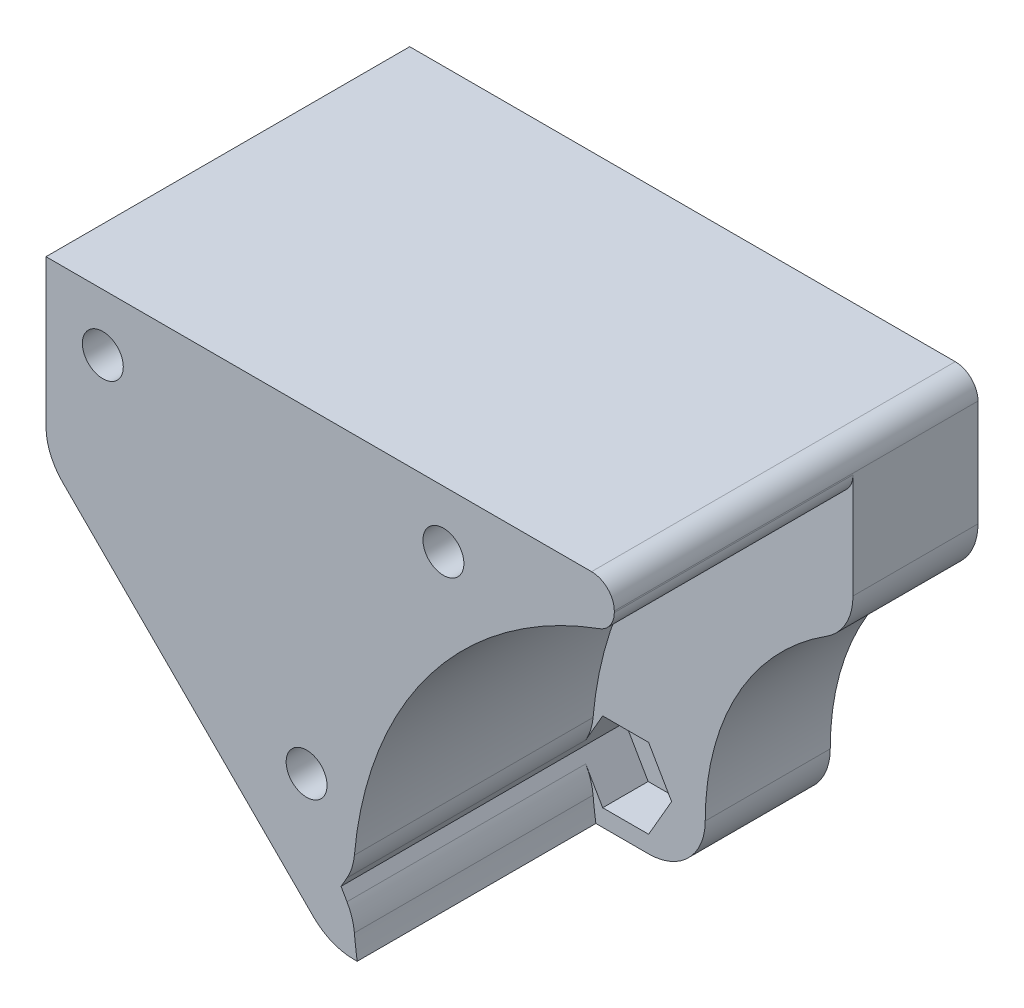
ISO-10303-21;
HEADER;
FILE_DESCRIPTION(('STEP AP214'),'2;1');
FILE_NAME('part.step','',(''),(''),'','','');
FILE_SCHEMA(('AUTOMOTIVE_DESIGN { 1 0 10303 214 1 1 1 1 }'));
ENDSEC;
DATA;
#1=APPLICATION_CONTEXT('core data for automotive mechanical design processes');
#2=APPLICATION_PROTOCOL_DEFINITION('international standard','automotive_design',2000,#1);
#3=PRODUCT_CONTEXT('',#1,'mechanical');
#4=PRODUCT('Part','Part','',(#3));
#5=PRODUCT_RELATED_PRODUCT_CATEGORY('part','',(#4));
#6=PRODUCT_DEFINITION_FORMATION('','',#4);
#7=PRODUCT_DEFINITION_CONTEXT('part definition',#1,'design');
#8=PRODUCT_DEFINITION('design','',#6,#7);
#9=PRODUCT_DEFINITION_SHAPE('','',#8);
#10=(LENGTH_UNIT() NAMED_UNIT(*) SI_UNIT(.MILLI.,.METRE.));
#11=(NAMED_UNIT(*) PLANE_ANGLE_UNIT() SI_UNIT($,.RADIAN.));
#12=(NAMED_UNIT(*) SI_UNIT($,.STERADIAN.) SOLID_ANGLE_UNIT());
#13=UNCERTAINTY_MEASURE_WITH_UNIT(LENGTH_MEASURE(1.E-05),#10,'distance_accuracy_value','');
#14=(GEOMETRIC_REPRESENTATION_CONTEXT(3) GLOBAL_UNCERTAINTY_ASSIGNED_CONTEXT((#13)) GLOBAL_UNIT_ASSIGNED_CONTEXT((#10,
#11,#12)) REPRESENTATION_CONTEXT('',''));
#15=CARTESIAN_POINT('',(0.,0.,0.));
#16=DIRECTION('',(0.,0.,1.));
#17=DIRECTION('',(1.,0.,0.));
#18=AXIS2_PLACEMENT_3D('',#15,#16,#17);
#19=CARTESIAN_POINT('',(12.7,6.35000000000008,13.97));
#20=DIRECTION('',(0.,0.,1.));
#21=DIRECTION('',(1.,0.,0.));
#22=AXIS2_PLACEMENT_3D('',#19,#20,#21);
#23=CYLINDRICAL_SURFACE('',#22,41.91);
#24=CARTESIAN_POINT('',(12.7,6.35000000000008,13.97));
#25=DIRECTION('',(0.,0.,1.));
#26=DIRECTION('',(1.,0.,0.));
#27=AXIS2_PLACEMENT_3D('',#24,#25,#26);
#28=CIRCLE('',#27,41.91);
#29=CARTESIAN_POINT('',(-29.0410163699359,2.59025899765198,13.97));
#30=VERTEX_POINT('',#29);
#31=CARTESIAN_POINT('',(-28.7261463329622,0.,13.97));
#32=VERTEX_POINT('',#31);
#33=EDGE_CURVE('E274',#30,#32,#28,.T.);
#34=ORIENTED_EDGE('',*,*,#33,.F.);
#35=DIRECTION('',(0.,0.,1.));
#36=VECTOR('',#35,1.);
#37=CARTESIAN_POINT('',(-29.0410163699359,2.59025899765198,13.97));
#38=LINE('',#37,#36);
#39=CARTESIAN_POINT('',(-29.0410163699359,2.59025899765198,40.64));
#40=VERTEX_POINT('',#39);
#41=EDGE_CURVE('E422',#30,#40,#38,.T.);
#42=ORIENTED_EDGE('',*,*,#41,.T.);
#43=CARTESIAN_POINT('',(12.7,6.35000000000008,40.64));
#44=DIRECTION('',(0.,0.,1.));
#45=DIRECTION('',(1.,0.,0.));
#46=AXIS2_PLACEMENT_3D('',#43,#44,#45);
#47=CIRCLE('',#46,41.91);
#48=CARTESIAN_POINT('',(-28.7261463329622,0.,40.64));
#49=VERTEX_POINT('',#48);
#50=EDGE_CURVE('E268',#40,#49,#47,.T.);
#51=ORIENTED_EDGE('',*,*,#50,.T.);
#52=DIRECTION('',(0.,0.,1.));
#53=VECTOR('',#52,1.);
#54=CARTESIAN_POINT('',(-28.7261463329622,0.,13.97));
#55=LINE('',#54,#53);
#56=EDGE_CURVE('E333',#32,#49,#55,.T.);
#57=ORIENTED_EDGE('',*,*,#56,.F.);
#58=EDGE_LOOP('',(#34,#42,#51,#57));
#59=FACE_BOUND('',#58,.T.);
#60=ADVANCED_FACE('F45',(#59),#23,.F.);
#61=CARTESIAN_POINT('',(-25.3999999999999,6.34999999999929,40.64));
#62=DIRECTION('',(0.,0.,-1.));
#63=DIRECTION('',(-1.,0.,0.));
#64=AXIS2_PLACEMENT_3D('',#61,#62,#63);
#65=CYLINDRICAL_SURFACE('',#64,2.28600000000001);
#66=CARTESIAN_POINT('',(-25.3999999999999,6.34999999999929,0.));
#67=DIRECTION('',(0.,0.,-1.));
#68=DIRECTION('',(-1.,0.,0.));
#69=AXIS2_PLACEMENT_3D('',#66,#67,#68);
#70=CIRCLE('',#69,2.28600000000001);
#71=CARTESIAN_POINT('',(-27.6859999999999,6.34999999999929,0.));
#72=VERTEX_POINT('',#71);
#73=EDGE_CURVE('E261',#72,#72,#70,.T.);
#74=ORIENTED_EDGE('',*,*,#73,.T.);
#75=EDGE_LOOP('',(#74));
#76=FACE_BOUND('',#75,.T.);
#77=CARTESIAN_POINT('',(-25.3999999999999,6.34999999999929,8.89));
#78=DIRECTION('',(0.,0.,1.));
#79=DIRECTION('',(1.,0.,0.));
#80=AXIS2_PLACEMENT_3D('',#77,#78,#79);
#81=CIRCLE('',#80,2.28600000000001);
#82=CARTESIAN_POINT('',(-23.1139999999999,6.34999999999929,8.89));
#83=VERTEX_POINT('',#82);
#84=EDGE_CURVE('E259',#83,#83,#81,.F.);
#85=ORIENTED_EDGE('',*,*,#84,.F.);
#86=EDGE_LOOP('',(#85));
#87=FACE_BOUND('',#86,.T.);
#88=ADVANCED_FACE('F533',(#76,#87),#65,.F.);
#89=CARTESIAN_POINT('',(0.,0.,40.64));
#90=DIRECTION('',(0.,0.,1.));
#91=DIRECTION('',(1.,0.,0.));
#92=AXIS2_PLACEMENT_3D('',#89,#90,#91);
#93=PLANE('',#92);
#94=DIRECTION('',(-0.5,-0.866025403784438,0.));
#95=VECTOR('',#94,1.);
#96=CARTESIAN_POINT('',(-27.9663219465478,10.7949999999993,40.64));
#97=LINE('',#96,#95);
#98=CARTESIAN_POINT('',(-29.8661514755922,7.50439872997479,40.64));
#99=VERTEX_POINT('',#98);
#100=CARTESIAN_POINT('',(-30.5326438930957,6.34999999999929,40.64));
#101=VERTEX_POINT('',#100);
#102=EDGE_CURVE('E211',#99,#101,#97,.T.);
#103=ORIENTED_EDGE('',*,*,#102,.F.);
#104=CARTESIAN_POINT('',(-35.3654127896234,10.6793987299748,40.64));
#105=DIRECTION('',(0.,0.,1.));
#106=DIRECTION('',(1.,0.,0.));
#107=AXIS2_PLACEMENT_3D('',#104,#105,#106);
#108=CIRCLE('',#107,6.35);
#109=CARTESIAN_POINT('',(-29.0410163699361,10.1097410023465,40.64));
#110=VERTEX_POINT('',#109);
#111=EDGE_CURVE('E420',#99,#110,#108,.T.);
#112=ORIENTED_EDGE('',*,*,#111,.T.);
#113=CARTESIAN_POINT('',(-1.66914285714286,45.7197324546539,40.64));
#114=VERTEX_POINT('',#113);
#115=EDGE_CURVE('E275',#114,#110,#47,.T.);
#116=ORIENTED_EDGE('',*,*,#115,.F.);
#117=CARTESIAN_POINT('',(-2.54,48.105776845845,40.64));
#118=DIRECTION('',(0.,0.,1.));
#119=DIRECTION('',(1.,0.,0.));
#120=AXIS2_PLACEMENT_3D('',#117,#118,#119);
#121=CIRCLE('',#120,2.54);
#122=CARTESIAN_POINT('',(0.,48.105776845845,40.64));
#123=VERTEX_POINT('',#122);
#124=EDGE_CURVE('E407',#114,#123,#121,.T.);
#125=ORIENTED_EDGE('',*,*,#124,.T.);
#126=DIRECTION('',(0.,1.,0.));
#127=VECTOR('',#126,1.);
#128=CARTESIAN_POINT('',(0.,0.,40.64));
#129=LINE('',#128,#127);
#130=CARTESIAN_POINT('',(0.,48.26,40.64));
#131=VERTEX_POINT('',#130);
#132=EDGE_CURVE('E300',#123,#131,#129,.T.);
#133=ORIENTED_EDGE('',*,*,#132,.T.);
#134=CARTESIAN_POINT('',(-2.54,48.26,40.64));
#135=DIRECTION('',(0.,0.,1.));
#136=DIRECTION('',(1.,0.,0.));
#137=AXIS2_PLACEMENT_3D('',#134,#135,#136);
#138=CIRCLE('',#137,2.54);
#139=CARTESIAN_POINT('',(-2.54,50.8,40.64));
#140=VERTEX_POINT('',#139);
#141=EDGE_CURVE('E409',#131,#140,#138,.T.);
#142=ORIENTED_EDGE('',*,*,#141,.T.);
#143=DIRECTION('',(-1.,0.,0.));
#144=VECTOR('',#143,1.);
#145=CARTESIAN_POINT('',(0.,50.8,40.64));
#146=LINE('',#145,#144);
#147=CARTESIAN_POINT('',(-63.5,50.8,40.64));
#148=VERTEX_POINT('',#147);
#149=EDGE_CURVE('E303',#140,#148,#146,.T.);
#150=ORIENTED_EDGE('',*,*,#149,.T.);
#151=DIRECTION('',(0.,-1.,0.));
#152=VECTOR('',#151,1.);
#153=CARTESIAN_POINT('',(-63.5,31.75,40.64));
#154=LINE('',#153,#152);
#155=CARTESIAN_POINT('',(-63.5,34.3802561210692,40.64));
#156=VERTEX_POINT('',#155);
#157=EDGE_CURVE('E306',#148,#156,#154,.T.);
#158=ORIENTED_EDGE('',*,*,#157,.T.);
#159=CARTESIAN_POINT('',(-57.15,34.3802561210692,40.64));
#160=DIRECTION('',(0.,0.,1.));
#161=DIRECTION('',(1.,0.,0.));
#162=AXIS2_PLACEMENT_3D('',#159,#160,#161);
#163=CIRCLE('',#162,6.35);
#164=CARTESIAN_POINT('',(-61.6401280605346,29.8901280605346,40.64));
#165=VERTEX_POINT('',#164);
#166=EDGE_CURVE('E391',#156,#165,#163,.T.);
#167=ORIENTED_EDGE('',*,*,#166,.T.);
#168=DIRECTION('',(0.707106781186552,-0.707106781186543,0.));
#169=VECTOR('',#168,1.);
#170=CARTESIAN_POINT('',(-63.5,31.75,40.64));
#171=LINE('',#170,#169);
#172=CARTESIAN_POINT('',(-33.6098719394651,1.8598719394654,40.64));
#173=VERTEX_POINT('',#172);
#174=EDGE_CURVE('E309',#165,#173,#171,.T.);
#175=ORIENTED_EDGE('',*,*,#174,.T.);
#176=CARTESIAN_POINT('',(-29.1197438789305,6.35,40.64));
#177=DIRECTION('',(0.,0.,1.));
#178=DIRECTION('',(1.,0.,0.));
#179=AXIS2_PLACEMENT_3D('',#176,#177,#178);
#180=CIRCLE('',#179,6.35);
#181=CARTESIAN_POINT('',(-29.1197438789305,0.,40.64));
#182=VERTEX_POINT('',#181);
#183=EDGE_CURVE('E393',#173,#182,#180,.T.);
#184=ORIENTED_EDGE('',*,*,#183,.T.);
#185=DIRECTION('',(1.,0.,0.));
#186=VECTOR('',#185,1.);
#187=CARTESIAN_POINT('',(0.,0.,40.64));
#188=LINE('',#187,#186);
#189=EDGE_CURVE('E312',#182,#49,#188,.T.);
#190=ORIENTED_EDGE('',*,*,#189,.T.);
#191=ORIENTED_EDGE('',*,*,#50,.F.);
#192=CARTESIAN_POINT('',(-35.3654127896232,2.02060127002348,40.64));
#193=DIRECTION('',(0.,0.,1.));
#194=DIRECTION('',(1.,0.,0.));
#195=AXIS2_PLACEMENT_3D('',#192,#193,#194);
#196=CIRCLE('',#195,6.35);
#197=CARTESIAN_POINT('',(-29.866151475592,5.19560127002348,40.64));
#198=VERTEX_POINT('',#197);
#199=EDGE_CURVE('E236',#40,#198,#196,.T.);
#200=ORIENTED_EDGE('',*,*,#199,.T.);
#201=DIRECTION('',(0.5,-0.866025403784439,0.));
#202=VECTOR('',#201,1.);
#203=CARTESIAN_POINT('',(-30.5326438930957,6.34999999999929,40.64));
#204=LINE('',#203,#202);
#205=EDGE_CURVE('E220',#101,#198,#204,.T.);
#206=ORIENTED_EDGE('',*,*,#205,.F.);
#207=EDGE_LOOP('',(#103,#112,#116,#125,#133,#142,#150,#158,#167,#175,#184,#190,#191,#200,#206));
#208=FACE_BOUND('',#207,.T.);
#209=CARTESIAN_POINT('',(-19.0917717752222,44.45,40.64));
#210=DIRECTION('',(0.,0.,1.));
#211=DIRECTION('',(1.,0.,0.));
#212=AXIS2_PLACEMENT_3D('',#209,#210,#211);
#213=CIRCLE('',#212,2.286);
#214=CARTESIAN_POINT('',(-16.8057717752222,44.45,40.64));
#215=VERTEX_POINT('',#214);
#216=EDGE_CURVE('E288',#215,#215,#213,.T.);
#217=ORIENTED_EDGE('',*,*,#216,.F.);
#218=EDGE_LOOP('',(#217));
#219=FACE_BOUND('',#218,.T.);
#220=CARTESIAN_POINT('',(-57.15,44.45,40.64));
#221=DIRECTION('',(0.,0.,1.));
#222=DIRECTION('',(1.,0.,0.));
#223=AXIS2_PLACEMENT_3D('',#220,#221,#222);
#224=CIRCLE('',#223,2.28599999999999);
#225=CARTESIAN_POINT('',(-54.864,44.45,40.64));
#226=VERTEX_POINT('',#225);
#227=EDGE_CURVE('E294',#226,#226,#224,.T.);
#228=ORIENTED_EDGE('',*,*,#227,.F.);
#229=EDGE_LOOP('',(#228));
#230=FACE_BOUND('',#229,.T.);
#231=CARTESIAN_POINT('',(-34.380256121069,15.3302561210692,40.64));
#232=DIRECTION('',(0.,0.,1.));
#233=DIRECTION('',(1.,0.,0.));
#234=AXIS2_PLACEMENT_3D('',#231,#232,#233);
#235=CIRCLE('',#234,2.28599999999999);
#236=CARTESIAN_POINT('',(-32.094256121069,15.3302561210692,40.64));
#237=VERTEX_POINT('',#236);
#238=EDGE_CURVE('E281',#237,#237,#235,.T.);
#239=ORIENTED_EDGE('',*,*,#238,.F.);
#240=EDGE_LOOP('',(#239));
#241=FACE_BOUND('',#240,.T.);
#242=ADVANCED_FACE('F233',(#208,#219,#230,#241),#93,.T.);
#243=CARTESIAN_POINT('',(0.,0.,0.));
#244=DIRECTION('',(0.,0.,1.));
#245=DIRECTION('',(1.,0.,0.));
#246=AXIS2_PLACEMENT_3D('',#243,#244,#245);
#247=PLANE('',#246);
#248=ORIENTED_EDGE('',*,*,#73,.F.);
#249=EDGE_LOOP('',(#248));
#250=FACE_BOUND('',#249,.T.);
#251=DIRECTION('',(-1.,0.,0.));
#252=VECTOR('',#251,1.);
#253=CARTESIAN_POINT('',(0.,50.8,0.));
#254=LINE('',#253,#252);
#255=CARTESIAN_POINT('',(-2.54,50.8,0.));
#256=VERTEX_POINT('',#255);
#257=CARTESIAN_POINT('',(-63.5,50.8,0.));
#258=VERTEX_POINT('',#257);
#259=EDGE_CURVE('E318',#256,#258,#254,.T.);
#260=ORIENTED_EDGE('',*,*,#259,.F.);
#261=CARTESIAN_POINT('',(-2.54,48.26,0.));
#262=DIRECTION('',(0.,0.,1.));
#263=DIRECTION('',(1.,0.,0.));
#264=AXIS2_PLACEMENT_3D('',#261,#262,#263);
#265=CIRCLE('',#264,2.54);
#266=CARTESIAN_POINT('',(0.,48.26,0.));
#267=VERTEX_POINT('',#266);
#268=EDGE_CURVE('E400',#256,#267,#265,.F.);
#269=ORIENTED_EDGE('',*,*,#268,.T.);
#270=DIRECTION('',(0.,1.,0.));
#271=VECTOR('',#270,1.);
#272=CARTESIAN_POINT('',(0.,0.,0.));
#273=LINE('',#272,#271);
#274=CARTESIAN_POINT('',(0.,36.3768396605438,0.));
#275=VERTEX_POINT('',#274);
#276=EDGE_CURVE('E297',#275,#267,#273,.T.);
#277=ORIENTED_EDGE('',*,*,#276,.F.);
#278=CARTESIAN_POINT('',(-6.35,36.3768396605438,0.));
#279=DIRECTION('',(0.,0.,1.));
#280=DIRECTION('',(1.,0.,0.));
#281=AXIS2_PLACEMENT_3D('',#278,#279,#280);
#282=CIRCLE('',#281,6.35);
#283=CARTESIAN_POINT('',(-2.94821428571428,31.0149040068752,0.));
#284=VERTEX_POINT('',#283);
#285=EDGE_CURVE('E368',#275,#284,#282,.F.);
#286=ORIENTED_EDGE('',*,*,#285,.T.);
#287=CARTESIAN_POINT('',(12.7,6.35000000000008,0.));
#288=DIRECTION('',(0.,0.,-1.));
#289=DIRECTION('',(-1.,0.,0.));
#290=AXIS2_PLACEMENT_3D('',#287,#288,#289);
#291=CIRCLE('',#290,29.21);
#292=CARTESIAN_POINT('',(-16.51,6.35000000000001,0.));
#293=VERTEX_POINT('',#292);
#294=EDGE_CURVE('E264',#293,#284,#291,.T.);
#295=ORIENTED_EDGE('',*,*,#294,.F.);
#296=CARTESIAN_POINT('',(-22.86,6.35,0.));
#297=DIRECTION('',(0.,0.,1.));
#298=DIRECTION('',(1.,0.,0.));
#299=AXIS2_PLACEMENT_3D('',#296,#297,#298);
#300=CIRCLE('',#299,6.35);
#301=CARTESIAN_POINT('',(-22.86,0.,0.));
#302=VERTEX_POINT('',#301);
#303=EDGE_CURVE('E365',#293,#302,#300,.F.);
#304=ORIENTED_EDGE('',*,*,#303,.T.);
#305=DIRECTION('',(1.,0.,0.));
#306=VECTOR('',#305,1.);
#307=CARTESIAN_POINT('',(0.,0.,0.));
#308=LINE('',#307,#306);
#309=CARTESIAN_POINT('',(-29.1197438789305,0.,0.));
#310=VERTEX_POINT('',#309);
#311=EDGE_CURVE('E304',#310,#302,#308,.T.);
#312=ORIENTED_EDGE('',*,*,#311,.F.);
#313=CARTESIAN_POINT('',(-29.1197438789305,6.35,0.));
#314=DIRECTION('',(0.,0.,1.));
#315=DIRECTION('',(1.,0.,0.));
#316=AXIS2_PLACEMENT_3D('',#313,#314,#315);
#317=CIRCLE('',#316,6.35);
#318=CARTESIAN_POINT('',(-33.6098719394651,1.8598719394654,0.));
#319=VERTEX_POINT('',#318);
#320=EDGE_CURVE('E363',#310,#319,#317,.F.);
#321=ORIENTED_EDGE('',*,*,#320,.T.);
#322=DIRECTION('',(0.707106781186552,-0.707106781186543,0.));
#323=VECTOR('',#322,1.);
#324=CARTESIAN_POINT('',(-63.5,31.75,0.));
#325=LINE('',#324,#323);
#326=CARTESIAN_POINT('',(-61.6401280605346,29.8901280605346,0.));
#327=VERTEX_POINT('',#326);
#328=EDGE_CURVE('E323',#327,#319,#325,.T.);
#329=ORIENTED_EDGE('',*,*,#328,.F.);
#330=CARTESIAN_POINT('',(-57.15,34.3802561210692,0.));
#331=DIRECTION('',(0.,0.,1.));
#332=DIRECTION('',(1.,0.,0.));
#333=AXIS2_PLACEMENT_3D('',#330,#331,#332);
#334=CIRCLE('',#333,6.35);
#335=CARTESIAN_POINT('',(-63.5,34.3802561210692,0.));
#336=VERTEX_POINT('',#335);
#337=EDGE_CURVE('E361',#327,#336,#334,.F.);
#338=ORIENTED_EDGE('',*,*,#337,.T.);
#339=DIRECTION('',(0.,-1.,0.));
#340=VECTOR('',#339,1.);
#341=CARTESIAN_POINT('',(-63.5,31.75,0.));
#342=LINE('',#341,#340);
#343=EDGE_CURVE('E320',#258,#336,#342,.T.);
#344=ORIENTED_EDGE('',*,*,#343,.F.);
#345=EDGE_LOOP('',(#260,#269,#277,#286,#295,#304,#312,#321,#329,#338,#344));
#346=FACE_BOUND('',#345,.T.);
#347=CARTESIAN_POINT('',(-57.15,44.45,0.));
#348=DIRECTION('',(0.,0.,1.));
#349=DIRECTION('',(1.,0.,0.));
#350=AXIS2_PLACEMENT_3D('',#347,#348,#349);
#351=CIRCLE('',#350,2.28599999999999);
#352=CARTESIAN_POINT('',(-54.864,44.45,0.));
#353=VERTEX_POINT('',#352);
#354=EDGE_CURVE('E291',#353,#353,#351,.T.);
#355=ORIENTED_EDGE('',*,*,#354,.T.);
#356=EDGE_LOOP('',(#355));
#357=FACE_BOUND('',#356,.T.);
#358=CARTESIAN_POINT('',(-19.0917717752222,44.45,0.));
#359=DIRECTION('',(0.,0.,1.));
#360=DIRECTION('',(1.,0.,0.));
#361=AXIS2_PLACEMENT_3D('',#358,#359,#360);
#362=CIRCLE('',#361,2.286);
#363=CARTESIAN_POINT('',(-16.8057717752222,44.45,0.));
#364=VERTEX_POINT('',#363);
#365=EDGE_CURVE('E285',#364,#364,#362,.T.);
#366=ORIENTED_EDGE('',*,*,#365,.T.);
#367=EDGE_LOOP('',(#366));
#368=FACE_BOUND('',#367,.T.);
#369=CARTESIAN_POINT('',(-34.380256121069,15.3302561210692,0.));
#370=DIRECTION('',(0.,0.,1.));
#371=DIRECTION('',(1.,0.,0.));
#372=AXIS2_PLACEMENT_3D('',#369,#370,#371);
#373=CIRCLE('',#372,2.28599999999999);
#374=CARTESIAN_POINT('',(-32.094256121069,15.3302561210692,0.));
#375=VERTEX_POINT('',#374);
#376=EDGE_CURVE('E280',#375,#375,#373,.T.);
#377=ORIENTED_EDGE('',*,*,#376,.T.);
#378=EDGE_LOOP('',(#377));
#379=FACE_BOUND('',#378,.T.);
#380=ADVANCED_FACE('F474',(#250,#346,#357,#368,#379),#247,.F.);
#381=CARTESIAN_POINT('',(0.,0.,40.64));
#382=DIRECTION('',(-1.,0.,0.));
#383=DIRECTION('',(0.,0.,1.));
#384=AXIS2_PLACEMENT_3D('',#381,#382,#383);
#385=PLANE('',#384);
#386=ORIENTED_EDGE('',*,*,#276,.T.);
#387=DIRECTION('',(0.,0.,-1.));
#388=VECTOR('',#387,1.);
#389=CARTESIAN_POINT('',(0.,48.26,40.64));
#390=LINE('',#389,#388);
#391=EDGE_CURVE('E405',#267,#131,#390,.F.);
#392=ORIENTED_EDGE('',*,*,#391,.T.);
#393=ORIENTED_EDGE('',*,*,#132,.F.);
#394=DIRECTION('',(0.,0.,1.));
#395=VECTOR('',#394,1.);
#396=CARTESIAN_POINT('',(0.,48.105776845845,40.64));
#397=LINE('',#396,#395);
#398=CARTESIAN_POINT('',(0.,48.105776845845,13.97));
#399=VERTEX_POINT('',#398);
#400=EDGE_CURVE('E402',#123,#399,#397,.F.);
#401=ORIENTED_EDGE('',*,*,#400,.T.);
#402=DIRECTION('',(0.,1.,0.));
#403=VECTOR('',#402,1.);
#404=CARTESIAN_POINT('',(0.,0.,13.97));
#405=LINE('',#404,#403);
#406=CARTESIAN_POINT('',(0.,36.3768396605438,13.97));
#407=VERTEX_POINT('',#406);
#408=EDGE_CURVE('E273',#407,#399,#405,.T.);
#409=ORIENTED_EDGE('',*,*,#408,.F.);
#410=DIRECTION('',(0.,0.,-1.));
#411=VECTOR('',#410,1.);
#412=CARTESIAN_POINT('',(0.,36.3768396605438,40.64));
#413=LINE('',#412,#411);
#414=EDGE_CURVE('E358',#407,#275,#413,.T.);
#415=ORIENTED_EDGE('',*,*,#414,.T.);
#416=EDGE_LOOP('',(#386,#392,#393,#401,#409,#415));
#417=FACE_BOUND('',#416,.T.);
#418=ADVANCED_FACE('F447',(#417),#385,.F.);
#419=CARTESIAN_POINT('',(0.,50.8,40.64));
#420=DIRECTION('',(0.,-1.,0.));
#421=DIRECTION('',(1.,0.,0.));
#422=AXIS2_PLACEMENT_3D('',#419,#420,#421);
#423=PLANE('',#422);
#424=ORIENTED_EDGE('',*,*,#149,.F.);
#425=DIRECTION('',(0.,0.,-1.));
#426=VECTOR('',#425,1.);
#427=CARTESIAN_POINT('',(-2.54,50.8,40.64));
#428=LINE('',#427,#426);
#429=EDGE_CURVE('E397',#140,#256,#428,.T.);
#430=ORIENTED_EDGE('',*,*,#429,.T.);
#431=ORIENTED_EDGE('',*,*,#259,.T.);
#432=DIRECTION('',(0.,0.,-1.));
#433=VECTOR('',#432,1.);
#434=CARTESIAN_POINT('',(-63.5,50.8,40.64));
#435=LINE('',#434,#433);
#436=EDGE_CURVE('E315',#148,#258,#435,.T.);
#437=ORIENTED_EDGE('',*,*,#436,.F.);
#438=EDGE_LOOP('',(#424,#430,#431,#437));
#439=FACE_BOUND('',#438,.T.);
#440=ADVANCED_FACE('F457',(#439),#423,.F.);
#441=CARTESIAN_POINT('',(-63.5,31.75,40.64));
#442=DIRECTION('',(1.,0.,0.));
#443=DIRECTION('',(0.,0.,-1.));
#444=AXIS2_PLACEMENT_3D('',#441,#442,#443);
#445=PLANE('',#444);
#446=ORIENTED_EDGE('',*,*,#343,.T.);
#447=DIRECTION('',(0.,0.,-1.));
#448=VECTOR('',#447,1.);
#449=CARTESIAN_POINT('',(-63.5,34.3802561210692,40.64));
#450=LINE('',#449,#448);
#451=EDGE_CURVE('E395',#336,#156,#450,.F.);
#452=ORIENTED_EDGE('',*,*,#451,.T.);
#453=ORIENTED_EDGE('',*,*,#157,.F.);
#454=ORIENTED_EDGE('',*,*,#436,.T.);
#455=EDGE_LOOP('',(#446,#452,#453,#454));
#456=FACE_BOUND('',#455,.T.);
#457=ADVANCED_FACE('F462',(#456),#445,.F.);
#458=CARTESIAN_POINT('',(-63.5,31.75,40.64));
#459=DIRECTION('',(0.707106781186543,0.707106781186552,0.));
#460=DIRECTION('',(-0.707106781186552,0.707106781186543,0.));
#461=AXIS2_PLACEMENT_3D('',#458,#459,#460);
#462=PLANE('',#461);
#463=ORIENTED_EDGE('',*,*,#328,.T.);
#464=DIRECTION('',(0.,0.,-1.));
#465=VECTOR('',#464,1.);
#466=CARTESIAN_POINT('',(-33.6098719394651,1.8598719394654,40.64));
#467=LINE('',#466,#465);
#468=EDGE_CURVE('E389',#319,#173,#467,.F.);
#469=ORIENTED_EDGE('',*,*,#468,.T.);
#470=ORIENTED_EDGE('',*,*,#174,.F.);
#471=DIRECTION('',(0.,0.,-1.));
#472=VECTOR('',#471,1.);
#473=CARTESIAN_POINT('',(-61.6401280605346,29.8901280605346,40.64));
#474=LINE('',#473,#472);
#475=EDGE_CURVE('E386',#165,#327,#474,.T.);
#476=ORIENTED_EDGE('',*,*,#475,.T.);
#477=EDGE_LOOP('',(#463,#469,#470,#476));
#478=FACE_BOUND('',#477,.T.);
#479=ADVANCED_FACE('F471',(#478),#462,.F.);
#480=CARTESIAN_POINT('',(0.,0.,40.64));
#481=DIRECTION('',(0.,1.,0.));
#482=DIRECTION('',(0.,0.,1.));
#483=AXIS2_PLACEMENT_3D('',#480,#481,#482);
#484=PLANE('',#483);
#485=ORIENTED_EDGE('',*,*,#311,.T.);
#486=DIRECTION('',(0.,0.,-1.));
#487=VECTOR('',#486,1.);
#488=CARTESIAN_POINT('',(-22.86,0.,40.64));
#489=LINE('',#488,#487);
#490=CARTESIAN_POINT('',(-22.86,0.,13.97));
#491=VERTEX_POINT('',#490);
#492=EDGE_CURVE('E383',#302,#491,#489,.F.);
#493=ORIENTED_EDGE('',*,*,#492,.T.);
#494=DIRECTION('',(1.,0.,0.));
#495=VECTOR('',#494,1.);
#496=CARTESIAN_POINT('',(0.,0.,13.97));
#497=LINE('',#496,#495);
#498=EDGE_CURVE('E330',#32,#491,#497,.T.);
#499=ORIENTED_EDGE('',*,*,#498,.F.);
#500=ORIENTED_EDGE('',*,*,#56,.T.);
#501=ORIENTED_EDGE('',*,*,#189,.F.);
#502=DIRECTION('',(0.,0.,-1.));
#503=VECTOR('',#502,1.);
#504=CARTESIAN_POINT('',(-29.1197438789305,0.,40.64));
#505=LINE('',#504,#503);
#506=EDGE_CURVE('E380',#182,#310,#505,.T.);
#507=ORIENTED_EDGE('',*,*,#506,.T.);
#508=EDGE_LOOP('',(#485,#493,#499,#500,#501,#507));
#509=FACE_BOUND('',#508,.T.);
#510=ADVANCED_FACE('F483',(#509),#484,.F.);
#511=CARTESIAN_POINT('',(-57.15,44.45,40.64));
#512=DIRECTION('',(0.,0.,-1.));
#513=DIRECTION('',(-1.,0.,0.));
#514=AXIS2_PLACEMENT_3D('',#511,#512,#513);
#515=CYLINDRICAL_SURFACE('',#514,2.28599999999999);
#516=ORIENTED_EDGE('',*,*,#227,.T.);
#517=EDGE_LOOP('',(#516));
#518=FACE_BOUND('',#517,.T.);
#519=ORIENTED_EDGE('',*,*,#354,.F.);
#520=EDGE_LOOP('',(#519));
#521=FACE_BOUND('',#520,.T.);
#522=ADVANCED_FACE('F554',(#518,#521),#515,.F.);
#523=CARTESIAN_POINT('',(-19.0917717752222,44.45,40.64));
#524=DIRECTION('',(0.,0.,-1.));
#525=DIRECTION('',(-1.,0.,0.));
#526=AXIS2_PLACEMENT_3D('',#523,#524,#525);
#527=CYLINDRICAL_SURFACE('',#526,2.286);
#528=ORIENTED_EDGE('',*,*,#216,.T.);
#529=EDGE_LOOP('',(#528));
#530=FACE_BOUND('',#529,.T.);
#531=ORIENTED_EDGE('',*,*,#365,.F.);
#532=EDGE_LOOP('',(#531));
#533=FACE_BOUND('',#532,.T.);
#534=ADVANCED_FACE('F549',(#530,#533),#527,.F.);
#535=CARTESIAN_POINT('',(-34.380256121069,15.3302561210692,40.64));
#536=DIRECTION('',(0.,0.,-1.));
#537=DIRECTION('',(-1.,0.,0.));
#538=AXIS2_PLACEMENT_3D('',#535,#536,#537);
#539=CYLINDRICAL_SURFACE('',#538,2.28599999999999);
#540=ORIENTED_EDGE('',*,*,#238,.T.);
#541=EDGE_LOOP('',(#540));
#542=FACE_BOUND('',#541,.T.);
#543=ORIENTED_EDGE('',*,*,#376,.F.);
#544=EDGE_LOOP('',(#543));
#545=FACE_BOUND('',#544,.T.);
#546=ADVANCED_FACE('F543',(#542,#545),#539,.F.);
#547=ORIENTED_EDGE('',*,*,#115,.T.);
#548=DIRECTION('',(0.,0.,1.));
#549=VECTOR('',#548,1.);
#550=CARTESIAN_POINT('',(-29.0410163699361,10.1097410023465,13.97));
#551=LINE('',#550,#549);
#552=CARTESIAN_POINT('',(-29.0410163699361,10.1097410023465,13.97));
#553=VERTEX_POINT('',#552);
#554=EDGE_CURVE('E415',#110,#553,#551,.F.);
#555=ORIENTED_EDGE('',*,*,#554,.T.);
#556=CARTESIAN_POINT('',(-1.66914285714286,45.7197324546539,13.97));
#557=VERTEX_POINT('',#556);
#558=EDGE_CURVE('E269',#557,#553,#28,.T.);
#559=ORIENTED_EDGE('',*,*,#558,.F.);
#560=DIRECTION('',(0.,0.,1.));
#561=VECTOR('',#560,1.);
#562=CARTESIAN_POINT('',(-1.66914285714286,45.7197324546539,13.97));
#563=LINE('',#562,#561);
#564=EDGE_CURVE('E411',#557,#114,#563,.T.);
#565=ORIENTED_EDGE('',*,*,#564,.T.);
#566=EDGE_LOOP('',(#547,#555,#559,#565));
#567=FACE_BOUND('',#566,.T.);
#568=ADVANCED_FACE('F438',(#567),#23,.F.);
#569=CARTESIAN_POINT('',(12.7,6.35000000000008,13.97));
#570=DIRECTION('',(0.,0.,1.));
#571=DIRECTION('',(1.,0.,0.));
#572=AXIS2_PLACEMENT_3D('',#569,#570,#571);
#573=PLANE('',#572);
#574=CARTESIAN_POINT('',(12.7,6.35000000000008,13.97));
#575=DIRECTION('',(0.,0.,1.));
#576=DIRECTION('',(1.,0.,0.));
#577=AXIS2_PLACEMENT_3D('',#574,#575,#576);
#578=CIRCLE('',#577,29.21);
#579=CARTESIAN_POINT('',(-2.94821428571428,31.0149040068752,13.97));
#580=VERTEX_POINT('',#579);
#581=CARTESIAN_POINT('',(-16.51,6.35000000000001,13.97));
#582=VERTEX_POINT('',#581);
#583=EDGE_CURVE('E336',#580,#582,#578,.T.);
#584=ORIENTED_EDGE('',*,*,#583,.F.);
#585=CARTESIAN_POINT('',(-6.35,36.3768396605438,13.97));
#586=DIRECTION('',(0.,0.,1.));
#587=DIRECTION('',(1.,0.,0.));
#588=AXIS2_PLACEMENT_3D('',#585,#586,#587);
#589=CIRCLE('',#588,6.35);
#590=EDGE_CURVE('E378',#580,#407,#589,.T.);
#591=ORIENTED_EDGE('',*,*,#590,.T.);
#592=ORIENTED_EDGE('',*,*,#408,.T.);
#593=CARTESIAN_POINT('',(-2.54,48.105776845845,13.97));
#594=DIRECTION('',(0.,0.,1.));
#595=DIRECTION('',(1.,0.,0.));
#596=AXIS2_PLACEMENT_3D('',#593,#594,#595);
#597=CIRCLE('',#596,2.54);
#598=EDGE_CURVE('E413',#399,#557,#597,.F.);
#599=ORIENTED_EDGE('',*,*,#598,.T.);
#600=ORIENTED_EDGE('',*,*,#558,.T.);
#601=CARTESIAN_POINT('',(-35.3654127896234,10.6793987299748,13.97));
#602=DIRECTION('',(0.,0.,1.));
#603=DIRECTION('',(1.,0.,0.));
#604=AXIS2_PLACEMENT_3D('',#601,#602,#603);
#605=CIRCLE('',#604,6.35);
#606=CARTESIAN_POINT('',(-29.8661514755922,7.50439872997479,13.97));
#607=VERTEX_POINT('',#606);
#608=EDGE_CURVE('E53',#553,#607,#605,.F.);
#609=ORIENTED_EDGE('',*,*,#608,.T.);
#610=DIRECTION('',(-0.5,-0.866025403784439,0.));
#611=VECTOR('',#610,1.);
#612=CARTESIAN_POINT('',(-19.7244829198214,25.0702839420934,13.97));
#613=LINE('',#612,#611);
#614=CARTESIAN_POINT('',(-27.9663219465478,10.7949999999993,13.97));
#615=VERTEX_POINT('',#614);
#616=EDGE_CURVE('E348',#615,#607,#613,.T.);
#617=ORIENTED_EDGE('',*,*,#616,.F.);
#618=DIRECTION('',(-1.,0.,0.));
#619=VECTOR('',#618,1.);
#620=CARTESIAN_POINT('',(12.7,10.7949999999993,13.97));
#621=LINE('',#620,#619);
#622=CARTESIAN_POINT('',(-22.833678053452,10.7949999999993,13.97));
#623=VERTEX_POINT('',#622);
#624=EDGE_CURVE('E345',#623,#615,#621,.T.);
#625=ORIENTED_EDGE('',*,*,#624,.F.);
#626=DIRECTION('',(-0.5,0.866025403784439,0.));
#627=VECTOR('',#626,1.);
#628=CARTESIAN_POINT('',(-12.0255170801784,-7.92528394209365,13.97));
#629=LINE('',#628,#627);
#630=CARTESIAN_POINT('',(-20.2673561069041,6.34999999999928,13.97));
#631=VERTEX_POINT('',#630);
#632=EDGE_CURVE('E340',#631,#623,#629,.T.);
#633=ORIENTED_EDGE('',*,*,#632,.F.);
#634=DIRECTION('',(0.5,0.866025403784439,0.));
#635=VECTOR('',#634,1.);
#636=CARTESIAN_POINT('',(-12.0255170801777,20.6252839420934,13.97));
#637=LINE('',#636,#635);
#638=CARTESIAN_POINT('',(-22.833678053452,1.90499999999929,13.97));
#639=VERTEX_POINT('',#638);
#640=EDGE_CURVE('E351',#639,#631,#637,.T.);
#641=ORIENTED_EDGE('',*,*,#640,.F.);
#642=DIRECTION('',(1.,0.,0.));
#643=VECTOR('',#642,1.);
#644=CARTESIAN_POINT('',(12.7,1.90499999999929,13.97));
#645=LINE('',#644,#643);
#646=CARTESIAN_POINT('',(-27.9663219465478,1.90499999999929,13.97));
#647=VERTEX_POINT('',#646);
#648=EDGE_CURVE('E355',#647,#639,#645,.T.);
#649=ORIENTED_EDGE('',*,*,#648,.F.);
#650=DIRECTION('',(0.5,-0.866025403784439,0.));
#651=VECTOR('',#650,1.);
#652=CARTESIAN_POINT('',(-19.7244829198221,-12.3702839420937,13.97));
#653=LINE('',#652,#651);
#654=CARTESIAN_POINT('',(-29.866151475592,5.19560127002348,13.97));
#655=VERTEX_POINT('',#654);
#656=EDGE_CURVE('E59',#655,#647,#653,.T.);
#657=ORIENTED_EDGE('',*,*,#656,.F.);
#658=CARTESIAN_POINT('',(-35.3654127896232,2.02060127002348,13.97));
#659=DIRECTION('',(0.,0.,1.));
#660=DIRECTION('',(1.,0.,0.));
#661=AXIS2_PLACEMENT_3D('',#658,#659,#660);
#662=CIRCLE('',#661,6.35);
#663=EDGE_CURVE('E12',#655,#30,#662,.F.);
#664=ORIENTED_EDGE('',*,*,#663,.T.);
#665=ORIENTED_EDGE('',*,*,#33,.T.);
#666=ORIENTED_EDGE('',*,*,#498,.T.);
#667=CARTESIAN_POINT('',(-22.86,6.35,13.97));
#668=DIRECTION('',(0.,0.,1.));
#669=DIRECTION('',(1.,0.,0.));
#670=AXIS2_PLACEMENT_3D('',#667,#668,#669);
#671=CIRCLE('',#670,6.35);
#672=EDGE_CURVE('E375',#491,#582,#671,.T.);
#673=ORIENTED_EDGE('',*,*,#672,.T.);
#674=EDGE_LOOP('',(#584,#591,#592,#599,#600,#609,#617,#625,#633,#641,#649,#657,#664,#665,#666,#673));
#675=FACE_BOUND('',#674,.T.);
#676=ADVANCED_FACE('F429',(#675),#573,.T.);
#677=CARTESIAN_POINT('',(12.7,6.35000000000008,40.64));
#678=DIRECTION('',(0.,0.,-1.));
#679=DIRECTION('',(-1.,0.,0.));
#680=AXIS2_PLACEMENT_3D('',#677,#678,#679);
#681=CYLINDRICAL_SURFACE('',#680,29.21);
#682=ORIENTED_EDGE('',*,*,#294,.T.);
#683=DIRECTION('',(0.,0.,-1.));
#684=VECTOR('',#683,1.);
#685=CARTESIAN_POINT('',(-2.94821428571428,31.0149040068752,40.64));
#686=LINE('',#685,#684);
#687=EDGE_CURVE('E373',#284,#580,#686,.F.);
#688=ORIENTED_EDGE('',*,*,#687,.T.);
#689=ORIENTED_EDGE('',*,*,#583,.T.);
#690=DIRECTION('',(0.,0.,-1.));
#691=VECTOR('',#690,1.);
#692=CARTESIAN_POINT('',(-16.51,6.35000000000001,40.64));
#693=LINE('',#692,#691);
#694=EDGE_CURVE('E370',#582,#293,#693,.T.);
#695=ORIENTED_EDGE('',*,*,#694,.T.);
#696=EDGE_LOOP('',(#682,#688,#689,#695));
#697=FACE_BOUND('',#696,.T.);
#698=ADVANCED_FACE('F548',(#697),#681,.F.);
#699=CARTESIAN_POINT('',(-30.5326438930957,6.34999999999929,-13.5796993093858));
#700=DIRECTION('',(-0.866025403784439,-0.5,0.));
#701=DIRECTION('',(0.5,-0.866025403784439,0.));
#702=AXIS2_PLACEMENT_3D('',#699,#700,#701);
#703=PLANE('',#702);
#704=ORIENTED_EDGE('',*,*,#205,.T.);
#705=DIRECTION('',(0.,0.,1.));
#706=VECTOR('',#705,1.);
#707=CARTESIAN_POINT('',(-29.866151475592,5.19560127002348,-13.5796993093858));
#708=LINE('',#707,#706);
#709=EDGE_CURVE('E425',#198,#655,#708,.F.);
#710=ORIENTED_EDGE('',*,*,#709,.T.);
#711=ORIENTED_EDGE('',*,*,#656,.T.);
#712=DIRECTION('',(0.,0.,1.));
#713=VECTOR('',#712,1.);
#714=CARTESIAN_POINT('',(-27.9663219465478,1.90499999999929,-13.5796993093858));
#715=LINE('',#714,#713);
#716=CARTESIAN_POINT('',(-27.9663219465478,1.90499999999929,8.89));
#717=VERTEX_POINT('',#716);
#718=EDGE_CURVE('E230',#717,#647,#715,.T.);
#719=ORIENTED_EDGE('',*,*,#718,.F.);
#720=DIRECTION('',(-0.5,0.866025403784439,0.));
#721=VECTOR('',#720,1.);
#722=CARTESIAN_POINT('',(-30.5326438930957,6.34999999999929,8.89));
#723=LINE('',#722,#721);
#724=CARTESIAN_POINT('',(-30.5326438930957,6.34999999999929,8.89));
#725=VERTEX_POINT('',#724);
#726=EDGE_CURVE('E228',#717,#725,#723,.T.);
#727=ORIENTED_EDGE('',*,*,#726,.T.);
#728=DIRECTION('',(0.,0.,1.));
#729=VECTOR('',#728,1.);
#730=CARTESIAN_POINT('',(-30.5326438930957,6.34999999999929,-13.5796993093858));
#731=LINE('',#730,#729);
#732=EDGE_CURVE('E214',#725,#101,#731,.T.);
#733=ORIENTED_EDGE('',*,*,#732,.T.);
#734=EDGE_LOOP('',(#704,#710,#711,#719,#727,#733));
#735=FACE_BOUND('',#734,.T.);
#736=ADVANCED_FACE('F224',(#735),#703,.F.);
#737=CARTESIAN_POINT('',(-27.9663219465478,10.7949999999993,-13.5796993093858));
#738=DIRECTION('',(-0.866025403784438,0.5,0.));
#739=DIRECTION('',(-0.5,-0.866025403784439,0.));
#740=AXIS2_PLACEMENT_3D('',#737,#738,#739);
#741=PLANE('',#740);
#742=ORIENTED_EDGE('',*,*,#616,.T.);
#743=DIRECTION('',(0.,0.,1.));
#744=VECTOR('',#743,1.);
#745=CARTESIAN_POINT('',(-29.8661514755922,7.50439872997479,-13.5796993093858));
#746=LINE('',#745,#744);
#747=EDGE_CURVE('E216',#607,#99,#746,.T.);
#748=ORIENTED_EDGE('',*,*,#747,.T.);
#749=ORIENTED_EDGE('',*,*,#102,.T.);
#750=ORIENTED_EDGE('',*,*,#732,.F.);
#751=DIRECTION('',(0.5,0.866025403784439,0.));
#752=VECTOR('',#751,1.);
#753=CARTESIAN_POINT('',(-27.9663219465478,10.7949999999993,8.89));
#754=LINE('',#753,#752);
#755=CARTESIAN_POINT('',(-27.9663219465478,10.7949999999993,8.89));
#756=VERTEX_POINT('',#755);
#757=EDGE_CURVE('E507',#725,#756,#754,.T.);
#758=ORIENTED_EDGE('',*,*,#757,.T.);
#759=DIRECTION('',(0.,0.,1.));
#760=VECTOR('',#759,1.);
#761=CARTESIAN_POINT('',(-27.9663219465478,10.7949999999993,-13.5796993093858));
#762=LINE('',#761,#760);
#763=EDGE_CURVE('E231',#756,#615,#762,.T.);
#764=ORIENTED_EDGE('',*,*,#763,.T.);
#765=EDGE_LOOP('',(#742,#748,#749,#750,#758,#764));
#766=FACE_BOUND('',#765,.T.);
#767=ADVANCED_FACE('F213',(#766),#741,.F.);
#768=CARTESIAN_POINT('',(0.,0.,8.89));
#769=DIRECTION('',(0.,0.,1.));
#770=DIRECTION('',(1.,0.,0.));
#771=AXIS2_PLACEMENT_3D('',#768,#769,#770);
#772=PLANE('',#771);
#773=DIRECTION('',(-0.5,-0.866025403784439,0.));
#774=VECTOR('',#773,1.);
#775=CARTESIAN_POINT('',(-22.833678053452,1.90499999999929,8.89));
#776=LINE('',#775,#774);
#777=CARTESIAN_POINT('',(-20.2673561069041,6.34999999999928,8.89));
#778=VERTEX_POINT('',#777);
#779=CARTESIAN_POINT('',(-22.833678053452,1.90499999999929,8.89));
#780=VERTEX_POINT('',#779);
#781=EDGE_CURVE('E260',#778,#780,#776,.T.);
#782=ORIENTED_EDGE('',*,*,#781,.F.);
#783=DIRECTION('',(0.5,-0.866025403784439,0.));
#784=VECTOR('',#783,1.);
#785=CARTESIAN_POINT('',(-20.2673561069041,6.34999999999928,8.89));
#786=LINE('',#785,#784);
#787=CARTESIAN_POINT('',(-22.833678053452,10.7949999999993,8.89));
#788=VERTEX_POINT('',#787);
#789=EDGE_CURVE('E256',#788,#778,#786,.T.);
#790=ORIENTED_EDGE('',*,*,#789,.F.);
#791=DIRECTION('',(1.,0.,0.));
#792=VECTOR('',#791,1.);
#793=CARTESIAN_POINT('',(-22.833678053452,10.7949999999993,8.89));
#794=LINE('',#793,#792);
#795=EDGE_CURVE('E247',#756,#788,#794,.T.);
#796=ORIENTED_EDGE('',*,*,#795,.F.);
#797=ORIENTED_EDGE('',*,*,#757,.F.);
#798=ORIENTED_EDGE('',*,*,#726,.F.);
#799=DIRECTION('',(-1.,0.,0.));
#800=VECTOR('',#799,1.);
#801=CARTESIAN_POINT('',(-27.9663219465478,1.90499999999929,8.89));
#802=LINE('',#801,#800);
#803=EDGE_CURVE('E494',#780,#717,#802,.T.);
#804=ORIENTED_EDGE('',*,*,#803,.F.);
#805=EDGE_LOOP('',(#782,#790,#796,#797,#798,#804));
#806=FACE_BOUND('',#805,.T.);
#807=ORIENTED_EDGE('',*,*,#84,.T.);
#808=EDGE_LOOP('',(#807));
#809=FACE_BOUND('',#808,.T.);
#810=ADVANCED_FACE('F504',(#806,#809),#772,.T.);
#811=CARTESIAN_POINT('',(-22.833678053452,1.90499999999929,-13.5796993093858));
#812=DIRECTION('',(0.866025403784439,-0.5,0.));
#813=DIRECTION('',(0.5,0.866025403784439,0.));
#814=AXIS2_PLACEMENT_3D('',#811,#812,#813);
#815=PLANE('',#814);
#816=ORIENTED_EDGE('',*,*,#640,.T.);
#817=DIRECTION('',(0.,0.,1.));
#818=VECTOR('',#817,1.);
#819=CARTESIAN_POINT('',(-20.2673561069041,6.34999999999928,-13.5796993093858));
#820=LINE('',#819,#818);
#821=EDGE_CURVE('E237',#778,#631,#820,.T.);
#822=ORIENTED_EDGE('',*,*,#821,.F.);
#823=ORIENTED_EDGE('',*,*,#781,.T.);
#824=DIRECTION('',(0.,0.,1.));
#825=VECTOR('',#824,1.);
#826=CARTESIAN_POINT('',(-22.833678053452,1.90499999999929,-13.5796993093858));
#827=LINE('',#826,#825);
#828=EDGE_CURVE('E244',#780,#639,#827,.T.);
#829=ORIENTED_EDGE('',*,*,#828,.T.);
#830=EDGE_LOOP('',(#816,#822,#823,#829));
#831=FACE_BOUND('',#830,.T.);
#832=ADVANCED_FACE('F499',(#831),#815,.F.);
#833=CARTESIAN_POINT('',(-27.9663219465478,1.90499999999929,-13.5796993093858));
#834=DIRECTION('',(0.,-1.,0.));
#835=DIRECTION('',(1.,0.,0.));
#836=AXIS2_PLACEMENT_3D('',#833,#834,#835);
#837=PLANE('',#836);
#838=ORIENTED_EDGE('',*,*,#648,.T.);
#839=ORIENTED_EDGE('',*,*,#828,.F.);
#840=ORIENTED_EDGE('',*,*,#803,.T.);
#841=ORIENTED_EDGE('',*,*,#718,.T.);
#842=EDGE_LOOP('',(#838,#839,#840,#841));
#843=FACE_BOUND('',#842,.T.);
#844=ADVANCED_FACE('F491',(#843),#837,.F.);
#845=CARTESIAN_POINT('',(-22.833678053452,10.7949999999993,-13.5796993093858));
#846=DIRECTION('',(0.,1.,0.));
#847=DIRECTION('',(0.,0.,1.));
#848=AXIS2_PLACEMENT_3D('',#845,#846,#847);
#849=PLANE('',#848);
#850=ORIENTED_EDGE('',*,*,#624,.T.);
#851=ORIENTED_EDGE('',*,*,#763,.F.);
#852=ORIENTED_EDGE('',*,*,#795,.T.);
#853=DIRECTION('',(0.,0.,1.));
#854=VECTOR('',#853,1.);
#855=CARTESIAN_POINT('',(-22.833678053452,10.7949999999993,-13.5796993093858));
#856=LINE('',#855,#854);
#857=EDGE_CURVE('E240',#788,#623,#856,.T.);
#858=ORIENTED_EDGE('',*,*,#857,.T.);
#859=EDGE_LOOP('',(#850,#851,#852,#858));
#860=FACE_BOUND('',#859,.T.);
#861=ADVANCED_FACE('F517',(#860),#849,.F.);
#862=CARTESIAN_POINT('',(-20.2673561069041,6.34999999999928,-13.5796993093858));
#863=DIRECTION('',(0.866025403784439,0.5,0.));
#864=DIRECTION('',(-0.5,0.866025403784439,0.));
#865=AXIS2_PLACEMENT_3D('',#862,#863,#864);
#866=PLANE('',#865);
#867=ORIENTED_EDGE('',*,*,#632,.T.);
#868=ORIENTED_EDGE('',*,*,#857,.F.);
#869=ORIENTED_EDGE('',*,*,#789,.T.);
#870=ORIENTED_EDGE('',*,*,#821,.T.);
#871=EDGE_LOOP('',(#867,#868,#869,#870));
#872=FACE_BOUND('',#871,.T.);
#873=ADVANCED_FACE('F519',(#872),#866,.F.);
#874=CARTESIAN_POINT('',(-6.35,36.3768396605438,40.64));
#875=DIRECTION('',(0.,0.,-1.));
#876=DIRECTION('',(-1.,0.,0.));
#877=AXIS2_PLACEMENT_3D('',#874,#875,#876);
#878=CYLINDRICAL_SURFACE('',#877,6.35);
#879=ORIENTED_EDGE('',*,*,#590,.F.);
#880=ORIENTED_EDGE('',*,*,#687,.F.);
#881=ORIENTED_EDGE('',*,*,#285,.F.);
#882=ORIENTED_EDGE('',*,*,#414,.F.);
#883=EDGE_LOOP('',(#879,#880,#881,#882));
#884=FACE_BOUND('',#883,.T.);
#885=ADVANCED_FACE('F521',(#884),#878,.T.);
#886=CARTESIAN_POINT('',(-22.86,6.35,40.64));
#887=DIRECTION('',(0.,0.,-1.));
#888=DIRECTION('',(-1.,0.,0.));
#889=AXIS2_PLACEMENT_3D('',#886,#887,#888);
#890=CYLINDRICAL_SURFACE('',#889,6.35);
#891=ORIENTED_EDGE('',*,*,#303,.F.);
#892=ORIENTED_EDGE('',*,*,#694,.F.);
#893=ORIENTED_EDGE('',*,*,#672,.F.);
#894=ORIENTED_EDGE('',*,*,#492,.F.);
#895=EDGE_LOOP('',(#891,#892,#893,#894));
#896=FACE_BOUND('',#895,.T.);
#897=ADVANCED_FACE('F527',(#896),#890,.T.);
#898=CARTESIAN_POINT('',(-29.1197438789305,6.35,40.64));
#899=DIRECTION('',(0.,0.,-1.));
#900=DIRECTION('',(-1.,0.,0.));
#901=AXIS2_PLACEMENT_3D('',#898,#899,#900);
#902=CYLINDRICAL_SURFACE('',#901,6.35);
#903=ORIENTED_EDGE('',*,*,#183,.F.);
#904=ORIENTED_EDGE('',*,*,#468,.F.);
#905=ORIENTED_EDGE('',*,*,#320,.F.);
#906=ORIENTED_EDGE('',*,*,#506,.F.);
#907=EDGE_LOOP('',(#903,#904,#905,#906));
#908=FACE_BOUND('',#907,.T.);
#909=ADVANCED_FACE('F480',(#908),#902,.T.);
#910=CARTESIAN_POINT('',(-57.15,34.3802561210692,40.64));
#911=DIRECTION('',(0.,0.,-1.));
#912=DIRECTION('',(-1.,0.,0.));
#913=AXIS2_PLACEMENT_3D('',#910,#911,#912);
#914=CYLINDRICAL_SURFACE('',#913,6.35);
#915=ORIENTED_EDGE('',*,*,#166,.F.);
#916=ORIENTED_EDGE('',*,*,#451,.F.);
#917=ORIENTED_EDGE('',*,*,#337,.F.);
#918=ORIENTED_EDGE('',*,*,#475,.F.);
#919=EDGE_LOOP('',(#915,#916,#917,#918));
#920=FACE_BOUND('',#919,.T.);
#921=ADVANCED_FACE('F468',(#920),#914,.T.);
#922=CARTESIAN_POINT('',(-2.54,48.26,40.64));
#923=DIRECTION('',(0.,0.,-1.));
#924=DIRECTION('',(-1.,0.,0.));
#925=AXIS2_PLACEMENT_3D('',#922,#923,#924);
#926=CYLINDRICAL_SURFACE('',#925,2.54);
#927=ORIENTED_EDGE('',*,*,#141,.F.);
#928=ORIENTED_EDGE('',*,*,#391,.F.);
#929=ORIENTED_EDGE('',*,*,#268,.F.);
#930=ORIENTED_EDGE('',*,*,#429,.F.);
#931=EDGE_LOOP('',(#927,#928,#929,#930));
#932=FACE_BOUND('',#931,.T.);
#933=ADVANCED_FACE('F452',(#932),#926,.T.);
#934=CARTESIAN_POINT('',(-2.54,48.105776845845,13.97));
#935=DIRECTION('',(0.,0.,1.));
#936=DIRECTION('',(1.,0.,0.));
#937=AXIS2_PLACEMENT_3D('',#934,#935,#936);
#938=CYLINDRICAL_SURFACE('',#937,2.54);
#939=ORIENTED_EDGE('',*,*,#124,.F.);
#940=ORIENTED_EDGE('',*,*,#564,.F.);
#941=ORIENTED_EDGE('',*,*,#598,.F.);
#942=ORIENTED_EDGE('',*,*,#400,.F.);
#943=EDGE_LOOP('',(#939,#940,#941,#942));
#944=FACE_BOUND('',#943,.T.);
#945=ADVANCED_FACE('F442',(#944),#938,.T.);
#946=CARTESIAN_POINT('',(-35.3654127896234,10.6793987299748,13.97));
#947=DIRECTION('',(0.,0.,1.));
#948=DIRECTION('',(1.,0.,0.));
#949=AXIS2_PLACEMENT_3D('',#946,#947,#948);
#950=CYLINDRICAL_SURFACE('',#949,6.35);
#951=ORIENTED_EDGE('',*,*,#111,.F.);
#952=ORIENTED_EDGE('',*,*,#747,.F.);
#953=ORIENTED_EDGE('',*,*,#608,.F.);
#954=ORIENTED_EDGE('',*,*,#554,.F.);
#955=EDGE_LOOP('',(#951,#952,#953,#954));
#956=FACE_BOUND('',#955,.T.);
#957=ADVANCED_FACE('F434',(#956),#950,.T.);
#958=CARTESIAN_POINT('',(-35.3654127896232,2.02060127002348,13.97));
#959=DIRECTION('',(0.,0.,1.));
#960=DIRECTION('',(1.,0.,0.));
#961=AXIS2_PLACEMENT_3D('',#958,#959,#960);
#962=CYLINDRICAL_SURFACE('',#961,6.35);
#963=ORIENTED_EDGE('',*,*,#663,.F.);
#964=ORIENTED_EDGE('',*,*,#709,.F.);
#965=ORIENTED_EDGE('',*,*,#199,.F.);
#966=ORIENTED_EDGE('',*,*,#41,.F.);
#967=EDGE_LOOP('',(#963,#964,#965,#966));
#968=FACE_BOUND('',#967,.T.);
#969=ADVANCED_FACE('F47',(#968),#962,.T.);
#970=CLOSED_SHELL('',(#60,#88,#242,#380,#418,#440,#457,#479,#510,#522,#534,#546,#568,#676,#698,
#736,#767,#810,#832,#844,#861,#873,#885,#897,#909,#921,#933,#945,#957,#969));
#971=MANIFOLD_SOLID_BREP('B2',#970);
#972=ADVANCED_BREP_SHAPE_REPRESENTATION('',(#18,#971),#14);
#973=SHAPE_DEFINITION_REPRESENTATION(#9,#972);
ENDSEC;
END-ISO-10303-21;
